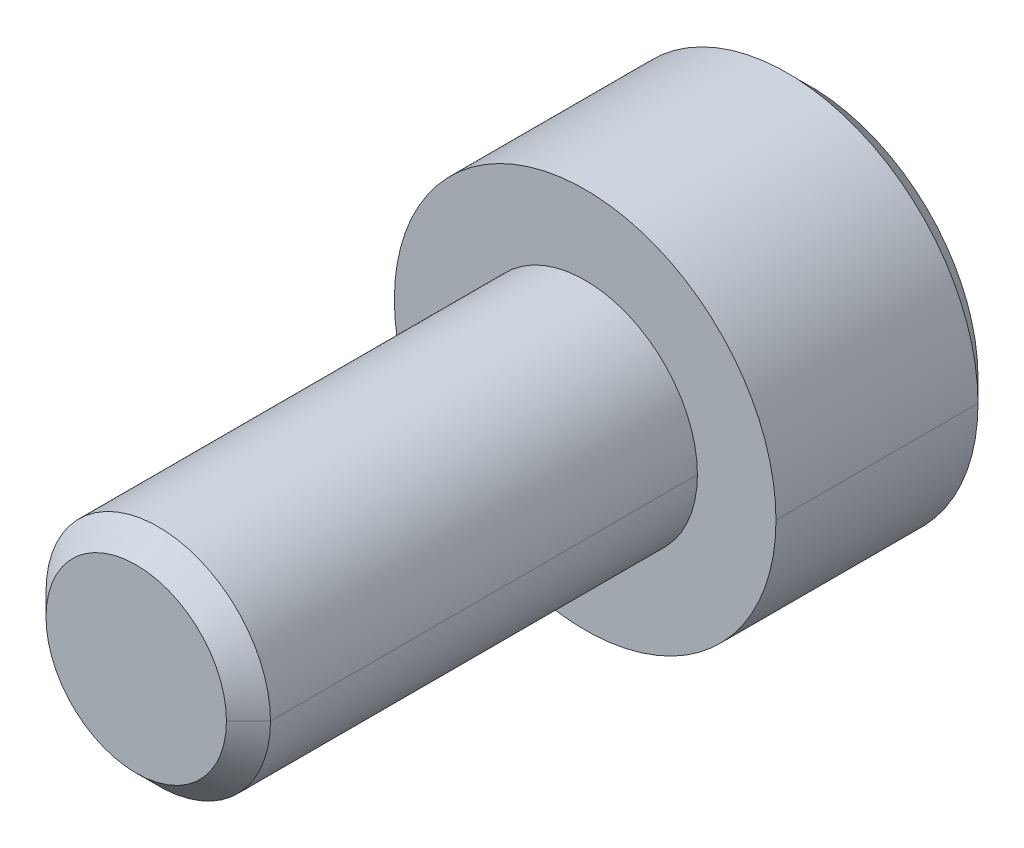
ISO-10303-21;
HEADER;
FILE_DESCRIPTION(('STEP AP214'),'2;1');
FILE_NAME('part.step','',(''),(''),'','','');
FILE_SCHEMA(('AUTOMOTIVE_DESIGN { 1 0 10303 214 1 1 1 1 }'));
ENDSEC;
DATA;
#1=APPLICATION_CONTEXT('core data for automotive mechanical design processes');
#2=APPLICATION_PROTOCOL_DEFINITION('international standard','automotive_design',2000,#1);
#3=PRODUCT_CONTEXT('',#1,'mechanical');
#4=PRODUCT('Part','Part','',(#3));
#5=PRODUCT_RELATED_PRODUCT_CATEGORY('part','',(#4));
#6=PRODUCT_DEFINITION_FORMATION('','',#4);
#7=PRODUCT_DEFINITION_CONTEXT('part definition',#1,'design');
#8=PRODUCT_DEFINITION('design','',#6,#7);
#9=PRODUCT_DEFINITION_SHAPE('','',#8);
#10=(LENGTH_UNIT() NAMED_UNIT(*) SI_UNIT(.MILLI.,.METRE.));
#11=(NAMED_UNIT(*) PLANE_ANGLE_UNIT() SI_UNIT($,.RADIAN.));
#12=(NAMED_UNIT(*) SI_UNIT($,.STERADIAN.) SOLID_ANGLE_UNIT());
#13=UNCERTAINTY_MEASURE_WITH_UNIT(LENGTH_MEASURE(1.E-05),#10,'distance_accuracy_value','');
#14=(GEOMETRIC_REPRESENTATION_CONTEXT(3) GLOBAL_UNCERTAINTY_ASSIGNED_CONTEXT((#13)) GLOBAL_UNIT_ASSIGNED_CONTEXT((#10,
#11,#12)) REPRESENTATION_CONTEXT('',''));
#15=CARTESIAN_POINT('',(0.,0.,0.));
#16=DIRECTION('',(0.,0.,1.));
#17=DIRECTION('',(1.,0.,0.));
#18=AXIS2_PLACEMENT_3D('',#15,#16,#17);
#19=CARTESIAN_POINT('',(0.,0.,2.5));
#20=DIRECTION('',(0.,0.,-1.));
#21=DIRECTION('',(0.,-1.,0.));
#22=AXIS2_PLACEMENT_3D('',#19,#20,#21);
#23=PLANE('',#22);
#24=DIRECTION('',(0.866025403784439,0.5,0.));
#25=VECTOR('',#24,1.);
#26=CARTESIAN_POINT('',(-2.,1.15470053837925,2.5));
#27=LINE('',#26,#25);
#28=CARTESIAN_POINT('',(-2.,1.15470053837925,2.5));
#29=VERTEX_POINT('',#28);
#30=CARTESIAN_POINT('',(0.,2.30940107675851,2.5));
#31=VERTEX_POINT('',#30);
#32=EDGE_CURVE('E186',#29,#31,#27,.T.);
#33=ORIENTED_EDGE('',*,*,#32,.T.);
#34=DIRECTION('',(0.866025403784439,-0.5,0.));
#35=VECTOR('',#34,1.);
#36=CARTESIAN_POINT('',(0.,2.30940107675851,2.5));
#37=LINE('',#36,#35);
#38=CARTESIAN_POINT('',(2.,1.15470053837925,2.5));
#39=VERTEX_POINT('',#38);
#40=EDGE_CURVE('E9',#31,#39,#37,.T.);
#41=ORIENTED_EDGE('',*,*,#40,.T.);
#42=DIRECTION('',(0.,-1.,0.));
#43=VECTOR('',#42,1.);
#44=CARTESIAN_POINT('',(2.,1.15470053837925,2.5));
#45=LINE('',#44,#43);
#46=CARTESIAN_POINT('',(2.,-1.15470053837925,2.5));
#47=VERTEX_POINT('',#46);
#48=EDGE_CURVE('E42',#39,#47,#45,.T.);
#49=ORIENTED_EDGE('',*,*,#48,.T.);
#50=DIRECTION('',(-0.866025403784439,-0.5,0.));
#51=VECTOR('',#50,1.);
#52=CARTESIAN_POINT('',(2.,-1.15470053837925,2.5));
#53=LINE('',#52,#51);
#54=CARTESIAN_POINT('',(0.,-2.30940107675851,2.5));
#55=VERTEX_POINT('',#54);
#56=EDGE_CURVE('E219',#47,#55,#53,.T.);
#57=ORIENTED_EDGE('',*,*,#56,.T.);
#58=DIRECTION('',(-0.866025403784439,0.5,0.));
#59=VECTOR('',#58,1.);
#60=CARTESIAN_POINT('',(0.,-2.30940107675851,2.5));
#61=LINE('',#60,#59);
#62=CARTESIAN_POINT('',(-2.,-1.15470053837925,2.5));
#63=VERTEX_POINT('',#62);
#64=EDGE_CURVE('E208',#55,#63,#61,.T.);
#65=ORIENTED_EDGE('',*,*,#64,.T.);
#66=DIRECTION('',(0.,1.,0.));
#67=VECTOR('',#66,1.);
#68=CARTESIAN_POINT('',(-2.,-1.15470053837925,2.5));
#69=LINE('',#68,#67);
#70=EDGE_CURVE('E185',#63,#29,#69,.T.);
#71=ORIENTED_EDGE('',*,*,#70,.T.);
#72=EDGE_LOOP('',(#33,#41,#49,#57,#65,#71));
#73=FACE_BOUND('',#72,.T.);
#74=ADVANCED_FACE('F15',(#73),#23,.T.);
#75=CARTESIAN_POINT('',(0.,2.30940107675851,2.5));
#76=DIRECTION('',(0.5,0.866025403784439,0.));
#77=DIRECTION('',(0.,0.,-1.));
#78=AXIS2_PLACEMENT_3D('',#75,#76,#77);
#79=PLANE('',#78);
#80=DIRECTION('',(0.866025403784439,-0.5,0.));
#81=VECTOR('',#80,1.);
#82=CARTESIAN_POINT('',(0.,2.30940107675851,0.));
#83=LINE('',#82,#81);
#84=CARTESIAN_POINT('',(0.,2.30940107675851,0.));
#85=VERTEX_POINT('',#84);
#86=CARTESIAN_POINT('',(2.,1.15470053837925,0.));
#87=VERTEX_POINT('',#86);
#88=EDGE_CURVE('E167',#85,#87,#83,.T.);
#89=ORIENTED_EDGE('',*,*,#88,.T.);
#90=DIRECTION('',(0.,0.,-1.));
#91=VECTOR('',#90,1.);
#92=CARTESIAN_POINT('',(2.,1.15470053837925,2.5));
#93=LINE('',#92,#91);
#94=EDGE_CURVE('E23',#39,#87,#93,.T.);
#95=ORIENTED_EDGE('',*,*,#94,.F.);
#96=ORIENTED_EDGE('',*,*,#40,.F.);
#97=DIRECTION('',(0.,0.,-1.));
#98=VECTOR('',#97,1.);
#99=CARTESIAN_POINT('',(0.,2.30940107675851,2.5));
#100=LINE('',#99,#98);
#101=EDGE_CURVE('E142',#31,#85,#100,.T.);
#102=ORIENTED_EDGE('',*,*,#101,.T.);
#103=EDGE_LOOP('',(#89,#95,#96,#102));
#104=FACE_BOUND('',#103,.T.);
#105=ADVANCED_FACE('F616',(#104),#79,.F.);
#106=CARTESIAN_POINT('',(2.,1.15470053837925,2.5));
#107=DIRECTION('',(1.,0.,0.));
#108=DIRECTION('',(0.,1.,0.));
#109=AXIS2_PLACEMENT_3D('',#106,#107,#108);
#110=PLANE('',#109);
#111=DIRECTION('',(0.,-1.,0.));
#112=VECTOR('',#111,1.);
#113=CARTESIAN_POINT('',(2.,1.15470053837925,0.));
#114=LINE('',#113,#112);
#115=CARTESIAN_POINT('',(2.,-1.15470053837925,0.));
#116=VERTEX_POINT('',#115);
#117=EDGE_CURVE('E253',#87,#116,#114,.T.);
#118=ORIENTED_EDGE('',*,*,#117,.T.);
#119=DIRECTION('',(0.,0.,-1.));
#120=VECTOR('',#119,1.);
#121=CARTESIAN_POINT('',(2.,-1.15470053837925,2.5));
#122=LINE('',#121,#120);
#123=EDGE_CURVE('E224',#47,#116,#122,.T.);
#124=ORIENTED_EDGE('',*,*,#123,.F.);
#125=ORIENTED_EDGE('',*,*,#48,.F.);
#126=ORIENTED_EDGE('',*,*,#94,.T.);
#127=EDGE_LOOP('',(#118,#124,#125,#126));
#128=FACE_BOUND('',#127,.T.);
#129=ADVANCED_FACE('F612',(#128),#110,.F.);
#130=CARTESIAN_POINT('',(2.,-1.15470053837925,2.5));
#131=DIRECTION('',(0.5,-0.866025403784439,0.));
#132=DIRECTION('',(0.,0.,-1.));
#133=AXIS2_PLACEMENT_3D('',#130,#131,#132);
#134=PLANE('',#133);
#135=DIRECTION('',(-0.866025403784439,-0.5,0.));
#136=VECTOR('',#135,1.);
#137=CARTESIAN_POINT('',(2.,-1.15470053837925,0.));
#138=LINE('',#137,#136);
#139=CARTESIAN_POINT('',(0.,-2.30940107675851,0.));
#140=VERTEX_POINT('',#139);
#141=EDGE_CURVE('E249',#116,#140,#138,.T.);
#142=ORIENTED_EDGE('',*,*,#141,.T.);
#143=DIRECTION('',(0.,0.,-1.));
#144=VECTOR('',#143,1.);
#145=CARTESIAN_POINT('',(0.,-2.30940107675851,2.5));
#146=LINE('',#145,#144);
#147=EDGE_CURVE('E211',#55,#140,#146,.T.);
#148=ORIENTED_EDGE('',*,*,#147,.F.);
#149=ORIENTED_EDGE('',*,*,#56,.F.);
#150=ORIENTED_EDGE('',*,*,#123,.T.);
#151=EDGE_LOOP('',(#142,#148,#149,#150));
#152=FACE_BOUND('',#151,.T.);
#153=ADVANCED_FACE('F489',(#152),#134,.F.);
#154=CARTESIAN_POINT('',(0.,-2.30940107675851,2.5));
#155=DIRECTION('',(-0.5,-0.866025403784439,0.));
#156=DIRECTION('',(-0.866025403784439,0.5,0.));
#157=AXIS2_PLACEMENT_3D('',#154,#155,#156);
#158=PLANE('',#157);
#159=DIRECTION('',(-0.866025403784439,0.5,0.));
#160=VECTOR('',#159,1.);
#161=CARTESIAN_POINT('',(0.,-2.30940107675851,0.));
#162=LINE('',#161,#160);
#163=CARTESIAN_POINT('',(-2.,-1.15470053837925,0.));
#164=VERTEX_POINT('',#163);
#165=EDGE_CURVE('E245',#140,#164,#162,.T.);
#166=ORIENTED_EDGE('',*,*,#165,.T.);
#167=DIRECTION('',(0.,0.,-1.));
#168=VECTOR('',#167,1.);
#169=CARTESIAN_POINT('',(-2.,-1.15470053837925,2.5));
#170=LINE('',#169,#168);
#171=EDGE_CURVE('E212',#63,#164,#170,.T.);
#172=ORIENTED_EDGE('',*,*,#171,.F.);
#173=ORIENTED_EDGE('',*,*,#64,.F.);
#174=ORIENTED_EDGE('',*,*,#147,.T.);
#175=EDGE_LOOP('',(#166,#172,#173,#174));
#176=FACE_BOUND('',#175,.T.);
#177=ADVANCED_FACE('F484',(#176),#158,.F.);
#178=CARTESIAN_POINT('',(-2.,-1.15470053837925,2.5));
#179=DIRECTION('',(-1.,0.,0.));
#180=DIRECTION('',(0.,0.,1.));
#181=AXIS2_PLACEMENT_3D('',#178,#179,#180);
#182=PLANE('',#181);
#183=DIRECTION('',(0.,1.,0.));
#184=VECTOR('',#183,1.);
#185=CARTESIAN_POINT('',(-2.,-1.15470053837925,0.));
#186=LINE('',#185,#184);
#187=CARTESIAN_POINT('',(-2.,1.15470053837925,0.));
#188=VERTEX_POINT('',#187);
#189=EDGE_CURVE('E241',#164,#188,#186,.T.);
#190=ORIENTED_EDGE('',*,*,#189,.T.);
#191=DIRECTION('',(0.,0.,-1.));
#192=VECTOR('',#191,1.);
#193=CARTESIAN_POINT('',(-2.,1.15470053837925,2.5));
#194=LINE('',#193,#192);
#195=EDGE_CURVE('E182',#29,#188,#194,.T.);
#196=ORIENTED_EDGE('',*,*,#195,.F.);
#197=ORIENTED_EDGE('',*,*,#70,.F.);
#198=ORIENTED_EDGE('',*,*,#171,.T.);
#199=EDGE_LOOP('',(#190,#196,#197,#198));
#200=FACE_BOUND('',#199,.T.);
#201=ADVANCED_FACE('F488',(#200),#182,.F.);
#202=CARTESIAN_POINT('',(-2.,1.15470053837925,2.5));
#203=DIRECTION('',(-0.5,0.866025403784439,0.));
#204=DIRECTION('',(0.,0.,1.));
#205=AXIS2_PLACEMENT_3D('',#202,#203,#204);
#206=PLANE('',#205);
#207=DIRECTION('',(0.866025403784439,0.5,0.));
#208=VECTOR('',#207,1.);
#209=CARTESIAN_POINT('',(-2.,1.15470053837925,0.));
#210=LINE('',#209,#208);
#211=EDGE_CURVE('E237',#188,#85,#210,.T.);
#212=ORIENTED_EDGE('',*,*,#211,.T.);
#213=ORIENTED_EDGE('',*,*,#101,.F.);
#214=ORIENTED_EDGE('',*,*,#32,.F.);
#215=ORIENTED_EDGE('',*,*,#195,.T.);
#216=EDGE_LOOP('',(#212,#213,#214,#215));
#217=FACE_BOUND('',#216,.T.);
#218=ADVANCED_FACE('F512',(#217),#206,.F.);
#219=CARTESIAN_POINT('',(0.,0.,15.));
#220=DIRECTION('',(0.,0.,-1.));
#221=DIRECTION('',(-1.,0.,0.));
#222=AXIS2_PLACEMENT_3D('',#219,#220,#221);
#223=CONICAL_SURFACE('',#222,2.0095,0.785398163397452);
#224=DIRECTION('',(0.70710678118655,0.,-0.707106781186545));
#225=VECTOR('',#224,1.);
#226=CARTESIAN_POINT('',(2.0095,0.,15.));
#227=LINE('',#226,#225);
#228=CARTESIAN_POINT('',(2.0095,0.,15.));
#229=VERTEX_POINT('',#228);
#230=CARTESIAN_POINT('',(2.5,0.,14.5095));
#231=VERTEX_POINT('',#230);
#232=EDGE_CURVE('E146',#229,#231,#227,.T.);
#233=ORIENTED_EDGE('',*,*,#232,.F.);
#234=CARTESIAN_POINT('',(0.,0.,15.));
#235=DIRECTION('',(0.,0.,1.));
#236=DIRECTION('',(1.,0.,0.));
#237=AXIS2_PLACEMENT_3D('',#234,#235,#236);
#238=CIRCLE('',#237,2.0095);
#239=CARTESIAN_POINT('',(-2.0095,0.,15.));
#240=VERTEX_POINT('',#239);
#241=EDGE_CURVE('E133',#240,#229,#238,.T.);
#242=ORIENTED_EDGE('',*,*,#241,.F.);
#243=DIRECTION('',(-0.70710678118655,0.,-0.707106781186545));
#244=VECTOR('',#243,1.);
#245=CARTESIAN_POINT('',(-2.0095,0.,15.));
#246=LINE('',#245,#244);
#247=CARTESIAN_POINT('',(-2.5,0.,14.5095));
#248=VERTEX_POINT('',#247);
#249=EDGE_CURVE('E155',#240,#248,#246,.T.);
#250=ORIENTED_EDGE('',*,*,#249,.T.);
#251=CARTESIAN_POINT('',(0.,0.,14.5095));
#252=DIRECTION('',(0.,0.,-1.));
#253=DIRECTION('',(1.,0.,0.));
#254=AXIS2_PLACEMENT_3D('',#251,#252,#253);
#255=CIRCLE('',#254,2.5);
#256=EDGE_CURVE('E143',#231,#248,#255,.T.);
#257=ORIENTED_EDGE('',*,*,#256,.F.);
#258=EDGE_LOOP('',(#233,#242,#250,#257));
#259=FACE_BOUND('',#258,.T.);
#260=ADVANCED_FACE('F147',(#259),#223,.T.);
#261=CARTESIAN_POINT('',(0.,0.,0.5));
#262=DIRECTION('',(0.,0.,1.));
#263=DIRECTION('',(1.,0.,0.));
#264=AXIS2_PLACEMENT_3D('',#261,#262,#263);
#265=CONICAL_SURFACE('',#264,4.25,0.785398163397449);
#266=DIRECTION('',(-0.707106781186548,0.,0.707106781186547));
#267=VECTOR('',#266,1.);
#268=CARTESIAN_POINT('',(-4.25,0.,0.5));
#269=LINE('',#268,#267);
#270=CARTESIAN_POINT('',(-3.75,0.,0.));
#271=VERTEX_POINT('',#270);
#272=CARTESIAN_POINT('',(-4.25,0.,0.5));
#273=VERTEX_POINT('',#272);
#274=EDGE_CURVE('E179',#271,#273,#269,.T.);
#275=ORIENTED_EDGE('',*,*,#274,.F.);
#276=CARTESIAN_POINT('',(0.,0.,0.));
#277=DIRECTION('',(0.,0.,-1.));
#278=DIRECTION('',(1.,0.,0.));
#279=AXIS2_PLACEMENT_3D('',#276,#277,#278);
#280=CIRCLE('',#279,3.75);
#281=CARTESIAN_POINT('',(3.75,0.,0.));
#282=VERTEX_POINT('',#281);
#283=EDGE_CURVE('E165',#282,#271,#280,.T.);
#284=ORIENTED_EDGE('',*,*,#283,.F.);
#285=DIRECTION('',(0.707106781186548,0.,0.707106781186547));
#286=VECTOR('',#285,1.);
#287=CARTESIAN_POINT('',(4.25,0.,0.5));
#288=LINE('',#287,#286);
#289=CARTESIAN_POINT('',(4.25,0.,0.5));
#290=VERTEX_POINT('',#289);
#291=EDGE_CURVE('E191',#282,#290,#288,.T.);
#292=ORIENTED_EDGE('',*,*,#291,.T.);
#293=CARTESIAN_POINT('',(0.,0.,0.5));
#294=DIRECTION('',(0.,0.,1.));
#295=DIRECTION('',(1.,0.,0.));
#296=AXIS2_PLACEMENT_3D('',#293,#294,#295);
#297=CIRCLE('',#296,4.25);
#298=EDGE_CURVE('E229',#273,#290,#297,.T.);
#299=ORIENTED_EDGE('',*,*,#298,.F.);
#300=EDGE_LOOP('',(#275,#284,#292,#299));
#301=FACE_BOUND('',#300,.T.);
#302=ADVANCED_FACE('F511',(#301),#265,.T.);
#303=CARTESIAN_POINT('',(0.,0.,15.));
#304=DIRECTION('',(0.,0.,1.));
#305=DIRECTION('',(1.,0.,0.));
#306=AXIS2_PLACEMENT_3D('',#303,#304,#305);
#307=PLANE('',#306);
#308=ORIENTED_EDGE('',*,*,#241,.T.);
#309=CARTESIAN_POINT('',(0.,0.,15.));
#310=DIRECTION('',(0.,0.,1.));
#311=DIRECTION('',(1.,0.,0.));
#312=AXIS2_PLACEMENT_3D('',#309,#310,#311);
#313=CIRCLE('',#312,2.0095);
#314=EDGE_CURVE('E137',#229,#240,#313,.T.);
#315=ORIENTED_EDGE('',*,*,#314,.T.);
#316=EDGE_LOOP('',(#308,#315));
#317=FACE_BOUND('',#316,.T.);
#318=ADVANCED_FACE('F135',(#317),#307,.T.);
#319=CARTESIAN_POINT('',(0.,0.,15.));
#320=DIRECTION('',(0.,0.,-1.));
#321=DIRECTION('',(-1.,0.,0.));
#322=AXIS2_PLACEMENT_3D('',#319,#320,#321);
#323=CYLINDRICAL_SURFACE('',#322,2.5);
#324=DIRECTION('',(0.,0.,-1.));
#325=VECTOR('',#324,1.);
#326=CARTESIAN_POINT('',(2.5,0.,15.));
#327=LINE('',#326,#325);
#328=CARTESIAN_POINT('',(2.5,0.,5.));
#329=VERTEX_POINT('',#328);
#330=EDGE_CURVE('E163',#231,#329,#327,.T.);
#331=ORIENTED_EDGE('',*,*,#330,.F.);
#332=ORIENTED_EDGE('',*,*,#256,.T.);
#333=DIRECTION('',(0.,0.,-1.));
#334=VECTOR('',#333,1.);
#335=CARTESIAN_POINT('',(-2.5,0.,15.));
#336=LINE('',#335,#334);
#337=CARTESIAN_POINT('',(-2.5,0.,5.));
#338=VERTEX_POINT('',#337);
#339=EDGE_CURVE('E202',#248,#338,#336,.T.);
#340=ORIENTED_EDGE('',*,*,#339,.T.);
#341=CARTESIAN_POINT('',(0.,0.,5.));
#342=DIRECTION('',(0.,0.,1.));
#343=DIRECTION('',(1.,0.,0.));
#344=AXIS2_PLACEMENT_3D('',#341,#342,#343);
#345=CIRCLE('',#344,2.5);
#346=EDGE_CURVE('E168',#338,#329,#345,.T.);
#347=ORIENTED_EDGE('',*,*,#346,.T.);
#348=EDGE_LOOP('',(#331,#332,#340,#347));
#349=FACE_BOUND('',#348,.T.);
#350=ADVANCED_FACE('F544',(#349),#323,.T.);
#351=CARTESIAN_POINT('',(0.,0.,0.));
#352=DIRECTION('',(0.,0.,1.));
#353=DIRECTION('',(1.,0.,0.));
#354=AXIS2_PLACEMENT_3D('',#351,#352,#353);
#355=PLANE('',#354);
#356=ORIENTED_EDGE('',*,*,#88,.F.);
#357=ORIENTED_EDGE('',*,*,#211,.F.);
#358=ORIENTED_EDGE('',*,*,#189,.F.);
#359=ORIENTED_EDGE('',*,*,#165,.F.);
#360=ORIENTED_EDGE('',*,*,#141,.F.);
#361=ORIENTED_EDGE('',*,*,#117,.F.);
#362=EDGE_LOOP('',(#356,#357,#358,#359,#360,#361));
#363=FACE_BOUND('',#362,.T.);
#364=ORIENTED_EDGE('',*,*,#283,.T.);
#365=CARTESIAN_POINT('',(0.,0.,0.));
#366=DIRECTION('',(0.,0.,-1.));
#367=DIRECTION('',(1.,0.,0.));
#368=AXIS2_PLACEMENT_3D('',#365,#366,#367);
#369=CIRCLE('',#368,3.75);
#370=EDGE_CURVE('E175',#271,#282,#369,.T.);
#371=ORIENTED_EDGE('',*,*,#370,.T.);
#372=EDGE_LOOP('',(#364,#371));
#373=FACE_BOUND('',#372,.T.);
#374=ADVANCED_FACE('F554',(#363,#373),#355,.F.);
#375=CARTESIAN_POINT('',(0.,0.,5.));
#376=DIRECTION('',(0.,0.,1.));
#377=DIRECTION('',(1.,0.,0.));
#378=AXIS2_PLACEMENT_3D('',#375,#376,#377);
#379=PLANE('',#378);
#380=ORIENTED_EDGE('',*,*,#346,.F.);
#381=CARTESIAN_POINT('',(0.,0.,5.));
#382=DIRECTION('',(0.,0.,1.));
#383=DIRECTION('',(1.,0.,0.));
#384=AXIS2_PLACEMENT_3D('',#381,#382,#383);
#385=CIRCLE('',#384,2.5);
#386=EDGE_CURVE('E198',#329,#338,#385,.T.);
#387=ORIENTED_EDGE('',*,*,#386,.F.);
#388=EDGE_LOOP('',(#380,#387));
#389=FACE_BOUND('',#388,.T.);
#390=CARTESIAN_POINT('',(0.,0.,5.));
#391=DIRECTION('',(0.,0.,1.));
#392=DIRECTION('',(1.,0.,0.));
#393=AXIS2_PLACEMENT_3D('',#390,#391,#392);
#394=CIRCLE('',#393,4.25);
#395=CARTESIAN_POINT('',(-4.25,0.,5.));
#396=VERTEX_POINT('',#395);
#397=CARTESIAN_POINT('',(4.25,0.,5.));
#398=VERTEX_POINT('',#397);
#399=EDGE_CURVE('E223',#396,#398,#394,.T.);
#400=ORIENTED_EDGE('',*,*,#399,.T.);
#401=CARTESIAN_POINT('',(0.,0.,5.));
#402=DIRECTION('',(0.,0.,1.));
#403=DIRECTION('',(1.,0.,0.));
#404=AXIS2_PLACEMENT_3D('',#401,#402,#403);
#405=CIRCLE('',#404,4.25);
#406=EDGE_CURVE('E203',#398,#396,#405,.T.);
#407=ORIENTED_EDGE('',*,*,#406,.T.);
#408=EDGE_LOOP('',(#400,#407));
#409=FACE_BOUND('',#408,.T.);
#410=ADVANCED_FACE('F533',(#389,#409),#379,.T.);
#411=CARTESIAN_POINT('',(0.,0.,5.));
#412=DIRECTION('',(0.,0.,-1.));
#413=DIRECTION('',(-1.,0.,0.));
#414=AXIS2_PLACEMENT_3D('',#411,#412,#413);
#415=CYLINDRICAL_SURFACE('',#414,4.25);
#416=DIRECTION('',(0.,0.,-1.));
#417=VECTOR('',#416,1.);
#418=CARTESIAN_POINT('',(4.25,0.,5.));
#419=LINE('',#418,#417);
#420=EDGE_CURVE('E207',#398,#290,#419,.T.);
#421=ORIENTED_EDGE('',*,*,#420,.F.);
#422=ORIENTED_EDGE('',*,*,#399,.F.);
#423=DIRECTION('',(0.,0.,-1.));
#424=VECTOR('',#423,1.);
#425=CARTESIAN_POINT('',(-4.25,0.,5.));
#426=LINE('',#425,#424);
#427=EDGE_CURVE('E216',#396,#273,#426,.T.);
#428=ORIENTED_EDGE('',*,*,#427,.T.);
#429=ORIENTED_EDGE('',*,*,#298,.T.);
#430=EDGE_LOOP('',(#421,#422,#428,#429));
#431=FACE_BOUND('',#430,.T.);
#432=ADVANCED_FACE('F522',(#431),#415,.T.);
#433=CARTESIAN_POINT('',(0.,0.,5.));
#434=DIRECTION('',(0.,0.,-1.));
#435=DIRECTION('',(-1.,0.,0.));
#436=AXIS2_PLACEMENT_3D('',#433,#434,#435);
#437=CYLINDRICAL_SURFACE('',#436,4.25);
#438=ORIENTED_EDGE('',*,*,#406,.F.);
#439=ORIENTED_EDGE('',*,*,#420,.T.);
#440=CARTESIAN_POINT('',(0.,0.,0.5));
#441=DIRECTION('',(0.,0.,1.));
#442=DIRECTION('',(1.,0.,0.));
#443=AXIS2_PLACEMENT_3D('',#440,#441,#442);
#444=CIRCLE('',#443,4.25);
#445=EDGE_CURVE('E190',#290,#273,#444,.T.);
#446=ORIENTED_EDGE('',*,*,#445,.T.);
#447=ORIENTED_EDGE('',*,*,#427,.F.);
#448=EDGE_LOOP('',(#438,#439,#446,#447));
#449=FACE_BOUND('',#448,.T.);
#450=ADVANCED_FACE('F500',(#449),#437,.T.);
#451=CARTESIAN_POINT('',(0.,0.,15.));
#452=DIRECTION('',(0.,0.,-1.));
#453=DIRECTION('',(-1.,0.,0.));
#454=AXIS2_PLACEMENT_3D('',#451,#452,#453);
#455=CYLINDRICAL_SURFACE('',#454,2.5);
#456=CARTESIAN_POINT('',(0.,0.,14.5095));
#457=DIRECTION('',(0.,0.,-1.));
#458=DIRECTION('',(1.,0.,0.));
#459=AXIS2_PLACEMENT_3D('',#456,#457,#458);
#460=CIRCLE('',#459,2.5);
#461=EDGE_CURVE('E152',#248,#231,#460,.T.);
#462=ORIENTED_EDGE('',*,*,#461,.T.);
#463=ORIENTED_EDGE('',*,*,#330,.T.);
#464=ORIENTED_EDGE('',*,*,#386,.T.);
#465=ORIENTED_EDGE('',*,*,#339,.F.);
#466=EDGE_LOOP('',(#462,#463,#464,#465));
#467=FACE_BOUND('',#466,.T.);
#468=ADVANCED_FACE('F476',(#467),#455,.T.);
#469=CARTESIAN_POINT('',(0.,0.,0.5));
#470=DIRECTION('',(0.,0.,1.));
#471=DIRECTION('',(1.,0.,0.));
#472=AXIS2_PLACEMENT_3D('',#469,#470,#471);
#473=CONICAL_SURFACE('',#472,4.25,0.785398163397449);
#474=ORIENTED_EDGE('',*,*,#370,.F.);
#475=ORIENTED_EDGE('',*,*,#274,.T.);
#476=ORIENTED_EDGE('',*,*,#445,.F.);
#477=ORIENTED_EDGE('',*,*,#291,.F.);
#478=EDGE_LOOP('',(#474,#475,#476,#477));
#479=FACE_BOUND('',#478,.T.);
#480=ADVANCED_FACE('F466',(#479),#473,.T.);
#481=CARTESIAN_POINT('',(0.,0.,15.));
#482=DIRECTION('',(0.,0.,-1.));
#483=DIRECTION('',(-1.,0.,0.));
#484=AXIS2_PLACEMENT_3D('',#481,#482,#483);
#485=CONICAL_SURFACE('',#484,2.0095,0.785398163397452);
#486=ORIENTED_EDGE('',*,*,#314,.F.);
#487=ORIENTED_EDGE('',*,*,#232,.T.);
#488=ORIENTED_EDGE('',*,*,#461,.F.);
#489=ORIENTED_EDGE('',*,*,#249,.F.);
#490=EDGE_LOOP('',(#486,#487,#488,#489));
#491=FACE_BOUND('',#490,.T.);
#492=ADVANCED_FACE('F154',(#491),#485,.T.);
#493=CLOSED_SHELL('',(#74,#105,#129,#153,#177,#201,#218,#260,#302,#318,#350,#374,#410,#432,#450,
#468,#480,#492));
#494=MANIFOLD_SOLID_BREP('B1',#493);
#495=ADVANCED_BREP_SHAPE_REPRESENTATION('',(#18,#494),#14);
#496=SHAPE_DEFINITION_REPRESENTATION(#9,#495);
ENDSEC;
END-ISO-10303-21;
